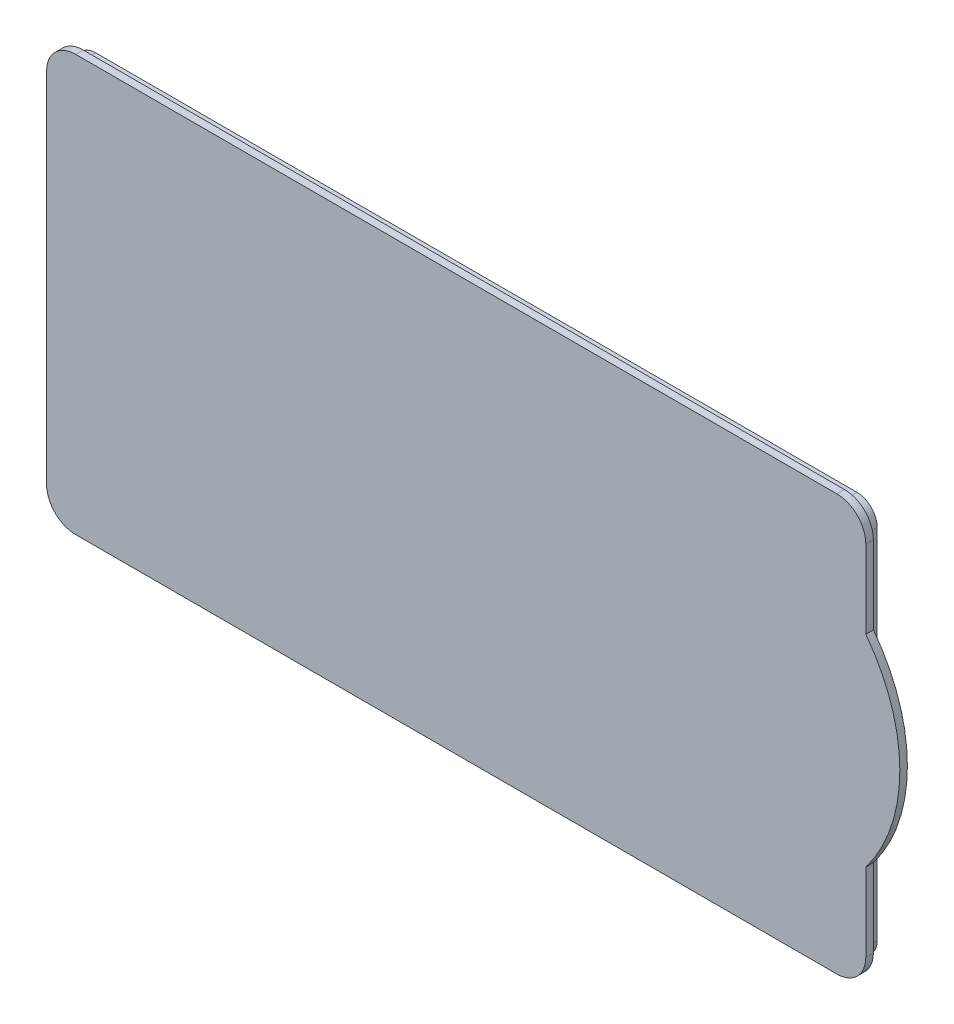
ISO-10303-21;
HEADER;
FILE_DESCRIPTION(('STEP AP214'),'2;1');
FILE_NAME('part.step','',(''),(''),'','','');
FILE_SCHEMA(('AUTOMOTIVE_DESIGN { 1 0 10303 214 1 1 1 1 }'));
ENDSEC;
DATA;
#1=APPLICATION_CONTEXT('core data for automotive mechanical design processes');
#2=APPLICATION_PROTOCOL_DEFINITION('international standard','automotive_design',2000,#1);
#3=PRODUCT_CONTEXT('',#1,'mechanical');
#4=PRODUCT('Part','Part','',(#3));
#5=PRODUCT_RELATED_PRODUCT_CATEGORY('part','',(#4));
#6=PRODUCT_DEFINITION_FORMATION('','',#4);
#7=PRODUCT_DEFINITION_CONTEXT('part definition',#1,'design');
#8=PRODUCT_DEFINITION('design','',#6,#7);
#9=PRODUCT_DEFINITION_SHAPE('','',#8);
#10=(LENGTH_UNIT() NAMED_UNIT(*) SI_UNIT(.MILLI.,.METRE.));
#11=(NAMED_UNIT(*) PLANE_ANGLE_UNIT() SI_UNIT($,.RADIAN.));
#12=(NAMED_UNIT(*) SI_UNIT($,.STERADIAN.) SOLID_ANGLE_UNIT());
#13=UNCERTAINTY_MEASURE_WITH_UNIT(LENGTH_MEASURE(1.E-05),#10,'distance_accuracy_value','');
#14=(GEOMETRIC_REPRESENTATION_CONTEXT(3) GLOBAL_UNCERTAINTY_ASSIGNED_CONTEXT((#13)) GLOBAL_UNIT_ASSIGNED_CONTEXT((#10,
#11,#12)) REPRESENTATION_CONTEXT('',''));
#15=CARTESIAN_POINT('',(0.,0.,0.));
#16=DIRECTION('',(0.,0.,1.));
#17=DIRECTION('',(1.,0.,0.));
#18=AXIS2_PLACEMENT_3D('',#15,#16,#17);
#19=CARTESIAN_POINT('',(151.,-71.,-3.));
#20=DIRECTION('',(0.,0.,1.));
#21=DIRECTION('',(1.,0.,0.));
#22=AXIS2_PLACEMENT_3D('',#19,#20,#21);
#23=PLANE('',#22);
#24=CARTESIAN_POINT('',(-151.,-71.,-3.));
#25=DIRECTION('',(0.,0.,-1.));
#26=DIRECTION('',(-1.,0.,0.));
#27=AXIS2_PLACEMENT_3D('',#24,#25,#26);
#28=CIRCLE('',#27,8.00000000000001);
#29=CARTESIAN_POINT('',(-151.,-79.,-3.));
#30=VERTEX_POINT('',#29);
#31=CARTESIAN_POINT('',(-159.,-71.,-3.));
#32=VERTEX_POINT('',#31);
#33=EDGE_CURVE('E49',#30,#32,#28,.T.);
#34=ORIENTED_EDGE('',*,*,#33,.F.);
#35=DIRECTION('',(-1.,0.,0.));
#36=VECTOR('',#35,1.);
#37=CARTESIAN_POINT('',(151.,-79.,-3.));
#38=LINE('',#37,#36);
#39=CARTESIAN_POINT('',(151.,-79.,-3.));
#40=VERTEX_POINT('',#39);
#41=EDGE_CURVE('E53',#40,#30,#38,.T.);
#42=ORIENTED_EDGE('',*,*,#41,.F.);
#43=CARTESIAN_POINT('',(151.,-71.,-3.));
#44=DIRECTION('',(0.,0.,-1.));
#45=DIRECTION('',(-1.,0.,0.));
#46=AXIS2_PLACEMENT_3D('',#43,#44,#45);
#47=CIRCLE('',#46,8.00000000000006);
#48=CARTESIAN_POINT('',(159.,-71.,-3.));
#49=VERTEX_POINT('',#48);
#50=EDGE_CURVE('E259',#49,#40,#47,.T.);
#51=ORIENTED_EDGE('',*,*,#50,.F.);
#52=DIRECTION('',(0.,-1.,0.));
#53=VECTOR('',#52,1.);
#54=CARTESIAN_POINT('',(159.,71.,-3.));
#55=LINE('',#54,#53);
#56=CARTESIAN_POINT('',(159.,71.,-3.));
#57=VERTEX_POINT('',#56);
#58=EDGE_CURVE('E256',#57,#49,#55,.T.);
#59=ORIENTED_EDGE('',*,*,#58,.F.);
#60=CARTESIAN_POINT('',(151.,71.,-3.));
#61=DIRECTION('',(0.,0.,-1.));
#62=DIRECTION('',(-1.,0.,0.));
#63=AXIS2_PLACEMENT_3D('',#60,#61,#62);
#64=CIRCLE('',#63,8.0000000000001);
#65=CARTESIAN_POINT('',(151.,79.0000000000001,-3.));
#66=VERTEX_POINT('',#65);
#67=EDGE_CURVE('E253',#66,#57,#64,.T.);
#68=ORIENTED_EDGE('',*,*,#67,.F.);
#69=DIRECTION('',(1.,0.,0.));
#70=VECTOR('',#69,1.);
#71=CARTESIAN_POINT('',(-151.,79.,-3.));
#72=LINE('',#71,#70);
#73=CARTESIAN_POINT('',(-151.,79.,-3.));
#74=VERTEX_POINT('',#73);
#75=EDGE_CURVE('E250',#74,#66,#72,.T.);
#76=ORIENTED_EDGE('',*,*,#75,.F.);
#77=CARTESIAN_POINT('',(-151.,70.9999999999999,-3.));
#78=DIRECTION('',(0.,0.,-1.));
#79=DIRECTION('',(-1.,0.,0.));
#80=AXIS2_PLACEMENT_3D('',#77,#78,#79);
#81=CIRCLE('',#80,8.00000000000002);
#82=CARTESIAN_POINT('',(-159.,70.9999999999999,-3.));
#83=VERTEX_POINT('',#82);
#84=EDGE_CURVE('E247',#83,#74,#81,.T.);
#85=ORIENTED_EDGE('',*,*,#84,.F.);
#86=DIRECTION('',(0.,1.,0.));
#87=VECTOR('',#86,1.);
#88=CARTESIAN_POINT('',(-159.,-71.,-3.));
#89=LINE('',#88,#87);
#90=EDGE_CURVE('E244',#32,#83,#89,.T.);
#91=ORIENTED_EDGE('',*,*,#90,.F.);
#92=EDGE_LOOP('',(#34,#42,#51,#59,#68,#76,#85,#91));
#93=FACE_BOUND('',#92,.T.);
#94=CARTESIAN_POINT('',(109.99074074074,0.,-3.));
#95=DIRECTION('',(0.,0.,1.));
#96=DIRECTION('',(1.,0.,0.));
#97=AXIS2_PLACEMENT_3D('',#94,#95,#96);
#98=CIRCLE('',#97,66.0092592592596);
#99=CARTESIAN_POINT('',(162.5,40.,-3.));
#100=VERTEX_POINT('',#99);
#101=CARTESIAN_POINT('',(162.5,-40.,-3.));
#102=VERTEX_POINT('',#101);
#103=EDGE_CURVE('E165',#100,#102,#98,.F.);
#104=ORIENTED_EDGE('',*,*,#103,.T.);
#105=DIRECTION('',(0.,-1.,0.));
#106=VECTOR('',#105,1.);
#107=CARTESIAN_POINT('',(162.5,-71.,-3.));
#108=LINE('',#107,#106);
#109=CARTESIAN_POINT('',(162.5,-71.,-3.));
#110=VERTEX_POINT('',#109);
#111=EDGE_CURVE('E528',#102,#110,#108,.T.);
#112=ORIENTED_EDGE('',*,*,#111,.T.);
#113=CARTESIAN_POINT('',(151.,-71.,-3.));
#114=DIRECTION('',(0.,0.,1.));
#115=DIRECTION('',(1.,0.,0.));
#116=AXIS2_PLACEMENT_3D('',#113,#114,#115);
#117=CIRCLE('',#116,11.5000000000001);
#118=CARTESIAN_POINT('',(151.,-82.5,-3.));
#119=VERTEX_POINT('',#118);
#120=EDGE_CURVE('E526',#110,#119,#117,.F.);
#121=ORIENTED_EDGE('',*,*,#120,.T.);
#122=DIRECTION('',(-1.,0.,0.));
#123=VECTOR('',#122,1.);
#124=CARTESIAN_POINT('',(-151.,-82.5,-3.));
#125=LINE('',#124,#123);
#126=CARTESIAN_POINT('',(-151.,-82.5,-3.));
#127=VERTEX_POINT('',#126);
#128=EDGE_CURVE('E523',#119,#127,#125,.T.);
#129=ORIENTED_EDGE('',*,*,#128,.T.);
#130=CARTESIAN_POINT('',(-151.,-71.,-3.));
#131=DIRECTION('',(0.,0.,1.));
#132=DIRECTION('',(1.,0.,0.));
#133=AXIS2_PLACEMENT_3D('',#130,#131,#132);
#134=CIRCLE('',#133,11.5);
#135=CARTESIAN_POINT('',(-162.5,-71.,-3.));
#136=VERTEX_POINT('',#135);
#137=EDGE_CURVE('E532',#127,#136,#134,.F.);
#138=ORIENTED_EDGE('',*,*,#137,.T.);
#139=DIRECTION('',(0.,1.,0.));
#140=VECTOR('',#139,1.);
#141=CARTESIAN_POINT('',(-162.5,70.9999999999999,-3.));
#142=LINE('',#141,#140);
#143=CARTESIAN_POINT('',(-162.5,70.9999999999999,-3.));
#144=VERTEX_POINT('',#143);
#145=EDGE_CURVE('E516',#136,#144,#142,.T.);
#146=ORIENTED_EDGE('',*,*,#145,.T.);
#147=CARTESIAN_POINT('',(-151.,70.9999999999999,-3.));
#148=DIRECTION('',(0.,0.,1.));
#149=DIRECTION('',(1.,0.,0.));
#150=AXIS2_PLACEMENT_3D('',#147,#148,#149);
#151=CIRCLE('',#150,11.5000000000001);
#152=CARTESIAN_POINT('',(-151.,82.5,-3.));
#153=VERTEX_POINT('',#152);
#154=EDGE_CURVE('E512',#144,#153,#151,.F.);
#155=ORIENTED_EDGE('',*,*,#154,.T.);
#156=DIRECTION('',(1.,0.,0.));
#157=VECTOR('',#156,1.);
#158=CARTESIAN_POINT('',(151.,82.5,-3.));
#159=LINE('',#158,#157);
#160=CARTESIAN_POINT('',(151.,82.5,-3.));
#161=VERTEX_POINT('',#160);
#162=EDGE_CURVE('E504',#153,#161,#159,.T.);
#163=ORIENTED_EDGE('',*,*,#162,.T.);
#164=CARTESIAN_POINT('',(151.,71.,-3.));
#165=DIRECTION('',(0.,0.,1.));
#166=DIRECTION('',(1.,0.,0.));
#167=AXIS2_PLACEMENT_3D('',#164,#165,#166);
#168=CIRCLE('',#167,11.5000000000001);
#169=CARTESIAN_POINT('',(162.5,71.,-3.));
#170=VERTEX_POINT('',#169);
#171=EDGE_CURVE('E207',#161,#170,#168,.F.);
#172=ORIENTED_EDGE('',*,*,#171,.T.);
#173=DIRECTION('',(0.,-1.,0.));
#174=VECTOR('',#173,1.);
#175=CARTESIAN_POINT('',(162.5,40.,-3.));
#176=LINE('',#175,#174);
#177=EDGE_CURVE('E223',#170,#100,#176,.T.);
#178=ORIENTED_EDGE('',*,*,#177,.T.);
#179=EDGE_LOOP('',(#104,#112,#121,#129,#138,#146,#155,#163,#172,#178));
#180=FACE_BOUND('',#179,.T.);
#181=ADVANCED_FACE('F34',(#93,#180),#23,.F.);
#182=CARTESIAN_POINT('',(-151.,-71.,-8.));
#183=DIRECTION('',(0.,0.,1.));
#184=DIRECTION('',(1.,0.,0.));
#185=AXIS2_PLACEMENT_3D('',#182,#183,#184);
#186=CYLINDRICAL_SURFACE('',#185,8.00000000000001);
#187=ORIENTED_EDGE('',*,*,#33,.T.);
#188=DIRECTION('',(0.,0.,1.));
#189=VECTOR('',#188,1.);
#190=CARTESIAN_POINT('',(-159.,-71.,-8.));
#191=LINE('',#190,#189);
#192=CARTESIAN_POINT('',(-159.,-71.,-8.));
#193=VERTEX_POINT('',#192);
#194=EDGE_CURVE('E11',#193,#32,#191,.T.);
#195=ORIENTED_EDGE('',*,*,#194,.F.);
#196=CARTESIAN_POINT('',(-151.,-71.,-8.));
#197=DIRECTION('',(0.,0.,-1.));
#198=DIRECTION('',(-1.,0.,0.));
#199=AXIS2_PLACEMENT_3D('',#196,#197,#198);
#200=CIRCLE('',#199,8.00000000000001);
#201=CARTESIAN_POINT('',(-151.,-79.,-8.));
#202=VERTEX_POINT('',#201);
#203=EDGE_CURVE('E225',#202,#193,#200,.T.);
#204=ORIENTED_EDGE('',*,*,#203,.F.);
#205=DIRECTION('',(0.,0.,1.));
#206=VECTOR('',#205,1.);
#207=CARTESIAN_POINT('',(-151.,-79.,-8.));
#208=LINE('',#207,#206);
#209=EDGE_CURVE('E242',#202,#30,#208,.T.);
#210=ORIENTED_EDGE('',*,*,#209,.T.);
#211=EDGE_LOOP('',(#187,#195,#204,#210));
#212=FACE_BOUND('',#211,.T.);
#213=ADVANCED_FACE('F304',(#212),#186,.T.);
#214=CARTESIAN_POINT('',(-159.,-71.,-8.));
#215=DIRECTION('',(1.,0.,0.));
#216=DIRECTION('',(0.,1.,0.));
#217=AXIS2_PLACEMENT_3D('',#214,#215,#216);
#218=PLANE('',#217);
#219=ORIENTED_EDGE('',*,*,#90,.T.);
#220=DIRECTION('',(0.,0.,1.));
#221=VECTOR('',#220,1.);
#222=CARTESIAN_POINT('',(-159.,70.9999999999999,-8.));
#223=LINE('',#222,#221);
#224=CARTESIAN_POINT('',(-159.,70.9999999999999,-8.));
#225=VERTEX_POINT('',#224);
#226=EDGE_CURVE('E42',#225,#83,#223,.T.);
#227=ORIENTED_EDGE('',*,*,#226,.F.);
#228=DIRECTION('',(0.,1.,0.));
#229=VECTOR('',#228,1.);
#230=CARTESIAN_POINT('',(-159.,-71.,-8.));
#231=LINE('',#230,#229);
#232=EDGE_CURVE('E228',#193,#225,#231,.T.);
#233=ORIENTED_EDGE('',*,*,#232,.F.);
#234=ORIENTED_EDGE('',*,*,#194,.T.);
#235=EDGE_LOOP('',(#219,#227,#233,#234));
#236=FACE_BOUND('',#235,.T.);
#237=ADVANCED_FACE('F285',(#236),#218,.F.);
#238=CARTESIAN_POINT('',(-151.,70.9999999999999,-8.));
#239=DIRECTION('',(0.,0.,1.));
#240=DIRECTION('',(1.,0.,0.));
#241=AXIS2_PLACEMENT_3D('',#238,#239,#240);
#242=CYLINDRICAL_SURFACE('',#241,8.00000000000002);
#243=ORIENTED_EDGE('',*,*,#84,.T.);
#244=DIRECTION('',(0.,0.,1.));
#245=VECTOR('',#244,1.);
#246=CARTESIAN_POINT('',(-151.,79.,-8.));
#247=LINE('',#246,#245);
#248=CARTESIAN_POINT('',(-151.,79.,-8.));
#249=VERTEX_POINT('',#248);
#250=EDGE_CURVE('E276',#249,#74,#247,.T.);
#251=ORIENTED_EDGE('',*,*,#250,.F.);
#252=CARTESIAN_POINT('',(-151.,70.9999999999999,-8.));
#253=DIRECTION('',(0.,0.,-1.));
#254=DIRECTION('',(-1.,0.,0.));
#255=AXIS2_PLACEMENT_3D('',#252,#253,#254);
#256=CIRCLE('',#255,8.00000000000002);
#257=EDGE_CURVE('E230',#225,#249,#256,.T.);
#258=ORIENTED_EDGE('',*,*,#257,.F.);
#259=ORIENTED_EDGE('',*,*,#226,.T.);
#260=EDGE_LOOP('',(#243,#251,#258,#259));
#261=FACE_BOUND('',#260,.T.);
#262=ADVANCED_FACE('F282',(#261),#242,.T.);
#263=CARTESIAN_POINT('',(-151.,79.,-8.));
#264=DIRECTION('',(0.,-1.,0.));
#265=DIRECTION('',(1.,0.,0.));
#266=AXIS2_PLACEMENT_3D('',#263,#264,#265);
#267=PLANE('',#266);
#268=ORIENTED_EDGE('',*,*,#75,.T.);
#269=DIRECTION('',(0.,0.,1.));
#270=VECTOR('',#269,1.);
#271=CARTESIAN_POINT('',(151.,79.0000000000001,-8.));
#272=LINE('',#271,#270);
#273=CARTESIAN_POINT('',(151.,79.0000000000001,-8.));
#274=VERTEX_POINT('',#273);
#275=EDGE_CURVE('E273',#274,#66,#272,.T.);
#276=ORIENTED_EDGE('',*,*,#275,.F.);
#277=DIRECTION('',(1.,0.,0.));
#278=VECTOR('',#277,1.);
#279=CARTESIAN_POINT('',(-151.,79.,-8.));
#280=LINE('',#279,#278);
#281=EDGE_CURVE('E232',#249,#274,#280,.T.);
#282=ORIENTED_EDGE('',*,*,#281,.F.);
#283=ORIENTED_EDGE('',*,*,#250,.T.);
#284=EDGE_LOOP('',(#268,#276,#282,#283));
#285=FACE_BOUND('',#284,.T.);
#286=ADVANCED_FACE('F290',(#285),#267,.F.);
#287=CARTESIAN_POINT('',(151.,71.,-8.));
#288=DIRECTION('',(0.,0.,1.));
#289=DIRECTION('',(1.,0.,0.));
#290=AXIS2_PLACEMENT_3D('',#287,#288,#289);
#291=CYLINDRICAL_SURFACE('',#290,8.0000000000001);
#292=ORIENTED_EDGE('',*,*,#67,.T.);
#293=DIRECTION('',(0.,0.,1.));
#294=VECTOR('',#293,1.);
#295=CARTESIAN_POINT('',(159.,71.,-8.));
#296=LINE('',#295,#294);
#297=CARTESIAN_POINT('',(159.,71.,-8.));
#298=VERTEX_POINT('',#297);
#299=EDGE_CURVE('E270',#298,#57,#296,.T.);
#300=ORIENTED_EDGE('',*,*,#299,.F.);
#301=CARTESIAN_POINT('',(151.,71.,-8.));
#302=DIRECTION('',(0.,0.,-1.));
#303=DIRECTION('',(-1.,0.,0.));
#304=AXIS2_PLACEMENT_3D('',#301,#302,#303);
#305=CIRCLE('',#304,8.0000000000001);
#306=EDGE_CURVE('E234',#274,#298,#305,.T.);
#307=ORIENTED_EDGE('',*,*,#306,.F.);
#308=ORIENTED_EDGE('',*,*,#275,.T.);
#309=EDGE_LOOP('',(#292,#300,#307,#308));
#310=FACE_BOUND('',#309,.T.);
#311=ADVANCED_FACE('F294',(#310),#291,.T.);
#312=CARTESIAN_POINT('',(159.,71.,-8.));
#313=DIRECTION('',(-1.,0.,0.));
#314=DIRECTION('',(0.,-1.,0.));
#315=AXIS2_PLACEMENT_3D('',#312,#313,#314);
#316=PLANE('',#315);
#317=ORIENTED_EDGE('',*,*,#58,.T.);
#318=DIRECTION('',(0.,0.,1.));
#319=VECTOR('',#318,1.);
#320=CARTESIAN_POINT('',(159.,-71.,-8.));
#321=LINE('',#320,#319);
#322=CARTESIAN_POINT('',(159.,-71.,-8.));
#323=VERTEX_POINT('',#322);
#324=EDGE_CURVE('E267',#323,#49,#321,.T.);
#325=ORIENTED_EDGE('',*,*,#324,.F.);
#326=DIRECTION('',(0.,-1.,0.));
#327=VECTOR('',#326,1.);
#328=CARTESIAN_POINT('',(159.,71.,-8.));
#329=LINE('',#328,#327);
#330=EDGE_CURVE('E236',#298,#323,#329,.T.);
#331=ORIENTED_EDGE('',*,*,#330,.F.);
#332=ORIENTED_EDGE('',*,*,#299,.T.);
#333=EDGE_LOOP('',(#317,#325,#331,#332));
#334=FACE_BOUND('',#333,.T.);
#335=ADVANCED_FACE('F312',(#334),#316,.F.);
#336=CARTESIAN_POINT('',(151.,-71.,-8.));
#337=DIRECTION('',(0.,0.,1.));
#338=DIRECTION('',(1.,0.,0.));
#339=AXIS2_PLACEMENT_3D('',#336,#337,#338);
#340=CYLINDRICAL_SURFACE('',#339,8.00000000000006);
#341=ORIENTED_EDGE('',*,*,#50,.T.);
#342=DIRECTION('',(0.,0.,1.));
#343=VECTOR('',#342,1.);
#344=CARTESIAN_POINT('',(151.,-79.,-8.));
#345=LINE('',#344,#343);
#346=CARTESIAN_POINT('',(151.,-79.,-8.));
#347=VERTEX_POINT('',#346);
#348=EDGE_CURVE('E264',#347,#40,#345,.T.);
#349=ORIENTED_EDGE('',*,*,#348,.F.);
#350=CARTESIAN_POINT('',(151.,-71.,-8.));
#351=DIRECTION('',(0.,0.,-1.));
#352=DIRECTION('',(-1.,0.,0.));
#353=AXIS2_PLACEMENT_3D('',#350,#351,#352);
#354=CIRCLE('',#353,8.00000000000006);
#355=EDGE_CURVE('E238',#323,#347,#354,.T.);
#356=ORIENTED_EDGE('',*,*,#355,.F.);
#357=ORIENTED_EDGE('',*,*,#324,.T.);
#358=EDGE_LOOP('',(#341,#349,#356,#357));
#359=FACE_BOUND('',#358,.T.);
#360=ADVANCED_FACE('F310',(#359),#340,.T.);
#361=CARTESIAN_POINT('',(151.,-79.,-8.));
#362=DIRECTION('',(0.,1.,0.));
#363=DIRECTION('',(0.,0.,1.));
#364=AXIS2_PLACEMENT_3D('',#361,#362,#363);
#365=PLANE('',#364);
#366=ORIENTED_EDGE('',*,*,#41,.T.);
#367=ORIENTED_EDGE('',*,*,#209,.F.);
#368=DIRECTION('',(-1.,0.,0.));
#369=VECTOR('',#368,1.);
#370=CARTESIAN_POINT('',(151.,-79.,-8.));
#371=LINE('',#370,#369);
#372=EDGE_CURVE('E240',#347,#202,#371,.T.);
#373=ORIENTED_EDGE('',*,*,#372,.F.);
#374=ORIENTED_EDGE('',*,*,#348,.T.);
#375=EDGE_LOOP('',(#366,#367,#373,#374));
#376=FACE_BOUND('',#375,.T.);
#377=ADVANCED_FACE('F306',(#376),#365,.F.);
#378=CARTESIAN_POINT('',(-151.,-71.,-8.));
#379=DIRECTION('',(0.,0.,-1.));
#380=DIRECTION('',(-1.,0.,0.));
#381=AXIS2_PLACEMENT_3D('',#378,#379,#380);
#382=PLANE('',#381);
#383=ORIENTED_EDGE('',*,*,#203,.T.);
#384=ORIENTED_EDGE('',*,*,#232,.T.);
#385=ORIENTED_EDGE('',*,*,#257,.T.);
#386=ORIENTED_EDGE('',*,*,#281,.T.);
#387=ORIENTED_EDGE('',*,*,#306,.T.);
#388=ORIENTED_EDGE('',*,*,#330,.T.);
#389=ORIENTED_EDGE('',*,*,#355,.T.);
#390=ORIENTED_EDGE('',*,*,#372,.T.);
#391=EDGE_LOOP('',(#383,#384,#385,#386,#387,#388,#389,#390));
#392=FACE_BOUND('',#391,.T.);
#393=ADVANCED_FACE('F298',(#392),#382,.T.);
#394=CARTESIAN_POINT('',(109.99074074074,0.,-379.573034085023));
#395=DIRECTION('',(0.,0.,1.));
#396=DIRECTION('',(1.,0.,0.));
#397=AXIS2_PLACEMENT_3D('',#394,#395,#396);
#398=CYLINDRICAL_SURFACE('',#397,66.0092592592596);
#399=ORIENTED_EDGE('',*,*,#103,.F.);
#400=DIRECTION('',(0.,0.,1.));
#401=VECTOR('',#400,1.);
#402=CARTESIAN_POINT('',(162.5,40.,-379.573034085023));
#403=LINE('',#402,#401);
#404=CARTESIAN_POINT('',(162.5,40.,0.));
#405=VERTEX_POINT('',#404);
#406=EDGE_CURVE('E158',#100,#405,#403,.T.);
#407=ORIENTED_EDGE('',*,*,#406,.T.);
#408=CARTESIAN_POINT('',(109.99074074074,0.,0.));
#409=DIRECTION('',(0.,0.,1.));
#410=DIRECTION('',(-1.,0.,0.));
#411=AXIS2_PLACEMENT_3D('',#408,#409,#410);
#412=CIRCLE('',#411,66.0092592592596);
#413=CARTESIAN_POINT('',(162.5,-40.,0.));
#414=VERTEX_POINT('',#413);
#415=EDGE_CURVE('E163',#414,#405,#412,.T.);
#416=ORIENTED_EDGE('',*,*,#415,.F.);
#417=DIRECTION('',(0.,0.,1.));
#418=VECTOR('',#417,1.);
#419=CARTESIAN_POINT('',(162.5,-40.,-379.573034085023));
#420=LINE('',#419,#418);
#421=EDGE_CURVE('E205',#102,#414,#420,.T.);
#422=ORIENTED_EDGE('',*,*,#421,.F.);
#423=EDGE_LOOP('',(#399,#407,#416,#422));
#424=FACE_BOUND('',#423,.T.);
#425=ADVANCED_FACE('F160',(#424),#398,.T.);
#426=CARTESIAN_POINT('',(162.5,-71.,-379.573034085023));
#427=DIRECTION('',(1.,0.,0.));
#428=DIRECTION('',(0.,1.,0.));
#429=AXIS2_PLACEMENT_3D('',#426,#427,#428);
#430=PLANE('',#429);
#431=ORIENTED_EDGE('',*,*,#111,.F.);
#432=ORIENTED_EDGE('',*,*,#421,.T.);
#433=DIRECTION('',(0.,1.,0.));
#434=VECTOR('',#433,1.);
#435=CARTESIAN_POINT('',(162.5,-71.,0.));
#436=LINE('',#435,#434);
#437=CARTESIAN_POINT('',(162.5,-71.,0.));
#438=VERTEX_POINT('',#437);
#439=EDGE_CURVE('E169',#438,#414,#436,.T.);
#440=ORIENTED_EDGE('',*,*,#439,.F.);
#441=DIRECTION('',(0.,0.,1.));
#442=VECTOR('',#441,1.);
#443=CARTESIAN_POINT('',(162.5,-71.,-379.573034085023));
#444=LINE('',#443,#442);
#445=EDGE_CURVE('E208',#110,#438,#444,.T.);
#446=ORIENTED_EDGE('',*,*,#445,.F.);
#447=EDGE_LOOP('',(#431,#432,#440,#446));
#448=FACE_BOUND('',#447,.T.);
#449=ADVANCED_FACE('F380',(#448),#430,.T.);
#450=CARTESIAN_POINT('',(151.,-71.,-379.573034085023));
#451=DIRECTION('',(0.,0.,1.));
#452=DIRECTION('',(1.,0.,0.));
#453=AXIS2_PLACEMENT_3D('',#450,#451,#452);
#454=CYLINDRICAL_SURFACE('',#453,11.5000000000001);
#455=ORIENTED_EDGE('',*,*,#120,.F.);
#456=ORIENTED_EDGE('',*,*,#445,.T.);
#457=CARTESIAN_POINT('',(151.,-71.,0.));
#458=DIRECTION('',(0.,0.,1.));
#459=DIRECTION('',(1.,0.,0.));
#460=AXIS2_PLACEMENT_3D('',#457,#458,#459);
#461=CIRCLE('',#460,11.5000000000001);
#462=CARTESIAN_POINT('',(151.,-82.5,0.));
#463=VERTEX_POINT('',#462);
#464=EDGE_CURVE('E202',#463,#438,#461,.T.);
#465=ORIENTED_EDGE('',*,*,#464,.F.);
#466=DIRECTION('',(0.,0.,1.));
#467=VECTOR('',#466,1.);
#468=CARTESIAN_POINT('',(151.,-82.5,-379.573034085023));
#469=LINE('',#468,#467);
#470=EDGE_CURVE('E210',#119,#463,#469,.T.);
#471=ORIENTED_EDGE('',*,*,#470,.F.);
#472=EDGE_LOOP('',(#455,#456,#465,#471));
#473=FACE_BOUND('',#472,.T.);
#474=ADVANCED_FACE('F389',(#473),#454,.T.);
#475=CARTESIAN_POINT('',(-151.,-82.5,-379.573034085023));
#476=DIRECTION('',(0.,-1.,0.));
#477=DIRECTION('',(0.,0.,-1.));
#478=AXIS2_PLACEMENT_3D('',#475,#476,#477);
#479=PLANE('',#478);
#480=ORIENTED_EDGE('',*,*,#128,.F.);
#481=ORIENTED_EDGE('',*,*,#470,.T.);
#482=DIRECTION('',(1.,0.,0.));
#483=VECTOR('',#482,1.);
#484=CARTESIAN_POINT('',(-151.,-82.5,0.));
#485=LINE('',#484,#483);
#486=CARTESIAN_POINT('',(-151.,-82.5,0.));
#487=VERTEX_POINT('',#486);
#488=EDGE_CURVE('E199',#487,#463,#485,.T.);
#489=ORIENTED_EDGE('',*,*,#488,.F.);
#490=DIRECTION('',(0.,0.,1.));
#491=VECTOR('',#490,1.);
#492=CARTESIAN_POINT('',(-151.,-82.5,-379.573034085023));
#493=LINE('',#492,#491);
#494=EDGE_CURVE('E212',#127,#487,#493,.T.);
#495=ORIENTED_EDGE('',*,*,#494,.F.);
#496=EDGE_LOOP('',(#480,#481,#489,#495));
#497=FACE_BOUND('',#496,.T.);
#498=ADVANCED_FACE('F399',(#497),#479,.T.);
#499=CARTESIAN_POINT('',(-151.,-71.,-379.573034085023));
#500=DIRECTION('',(0.,0.,1.));
#501=DIRECTION('',(1.,0.,0.));
#502=AXIS2_PLACEMENT_3D('',#499,#500,#501);
#503=CYLINDRICAL_SURFACE('',#502,11.5);
#504=ORIENTED_EDGE('',*,*,#137,.F.);
#505=ORIENTED_EDGE('',*,*,#494,.T.);
#506=CARTESIAN_POINT('',(-151.,-71.,0.));
#507=DIRECTION('',(0.,0.,1.));
#508=DIRECTION('',(1.,0.,0.));
#509=AXIS2_PLACEMENT_3D('',#506,#507,#508);
#510=CIRCLE('',#509,11.5);
#511=CARTESIAN_POINT('',(-162.5,-71.,0.));
#512=VERTEX_POINT('',#511);
#513=EDGE_CURVE('E196',#512,#487,#510,.T.);
#514=ORIENTED_EDGE('',*,*,#513,.F.);
#515=DIRECTION('',(0.,0.,1.));
#516=VECTOR('',#515,1.);
#517=CARTESIAN_POINT('',(-162.5,-71.,-379.573034085023));
#518=LINE('',#517,#516);
#519=EDGE_CURVE('E214',#136,#512,#518,.T.);
#520=ORIENTED_EDGE('',*,*,#519,.F.);
#521=EDGE_LOOP('',(#504,#505,#514,#520));
#522=FACE_BOUND('',#521,.T.);
#523=ADVANCED_FACE('F409',(#522),#503,.T.);
#524=CARTESIAN_POINT('',(-162.5,70.9999999999999,-379.573034085023));
#525=DIRECTION('',(-1.,0.,0.));
#526=DIRECTION('',(0.,-1.,0.));
#527=AXIS2_PLACEMENT_3D('',#524,#525,#526);
#528=PLANE('',#527);
#529=ORIENTED_EDGE('',*,*,#145,.F.);
#530=ORIENTED_EDGE('',*,*,#519,.T.);
#531=DIRECTION('',(0.,-1.,0.));
#532=VECTOR('',#531,1.);
#533=CARTESIAN_POINT('',(-162.5,70.9999999999999,0.));
#534=LINE('',#533,#532);
#535=CARTESIAN_POINT('',(-162.5,70.9999999999999,0.));
#536=VERTEX_POINT('',#535);
#537=EDGE_CURVE('E193',#536,#512,#534,.T.);
#538=ORIENTED_EDGE('',*,*,#537,.F.);
#539=DIRECTION('',(0.,0.,1.));
#540=VECTOR('',#539,1.);
#541=CARTESIAN_POINT('',(-162.5,70.9999999999999,-379.573034085023));
#542=LINE('',#541,#540);
#543=EDGE_CURVE('E216',#144,#536,#542,.T.);
#544=ORIENTED_EDGE('',*,*,#543,.F.);
#545=EDGE_LOOP('',(#529,#530,#538,#544));
#546=FACE_BOUND('',#545,.T.);
#547=ADVANCED_FACE('F419',(#546),#528,.T.);
#548=CARTESIAN_POINT('',(-151.,70.9999999999999,-379.573034085023));
#549=DIRECTION('',(0.,0.,1.));
#550=DIRECTION('',(1.,0.,0.));
#551=AXIS2_PLACEMENT_3D('',#548,#549,#550);
#552=CYLINDRICAL_SURFACE('',#551,11.5000000000001);
#553=ORIENTED_EDGE('',*,*,#154,.F.);
#554=ORIENTED_EDGE('',*,*,#543,.T.);
#555=CARTESIAN_POINT('',(-151.,70.9999999999999,0.));
#556=DIRECTION('',(0.,0.,1.));
#557=DIRECTION('',(1.,0.,0.));
#558=AXIS2_PLACEMENT_3D('',#555,#556,#557);
#559=CIRCLE('',#558,11.5000000000001);
#560=CARTESIAN_POINT('',(-151.,82.5,0.));
#561=VERTEX_POINT('',#560);
#562=EDGE_CURVE('E190',#561,#536,#559,.T.);
#563=ORIENTED_EDGE('',*,*,#562,.F.);
#564=DIRECTION('',(0.,0.,1.));
#565=VECTOR('',#564,1.);
#566=CARTESIAN_POINT('',(-151.,82.5,-379.573034085023));
#567=LINE('',#566,#565);
#568=EDGE_CURVE('E218',#153,#561,#567,.T.);
#569=ORIENTED_EDGE('',*,*,#568,.F.);
#570=EDGE_LOOP('',(#553,#554,#563,#569));
#571=FACE_BOUND('',#570,.T.);
#572=ADVANCED_FACE('F429',(#571),#552,.T.);
#573=CARTESIAN_POINT('',(151.,82.5,-379.573034085023));
#574=DIRECTION('',(0.,1.,0.));
#575=DIRECTION('',(-1.,0.,0.));
#576=AXIS2_PLACEMENT_3D('',#573,#574,#575);
#577=PLANE('',#576);
#578=ORIENTED_EDGE('',*,*,#162,.F.);
#579=ORIENTED_EDGE('',*,*,#568,.T.);
#580=DIRECTION('',(-1.,0.,0.));
#581=VECTOR('',#580,1.);
#582=CARTESIAN_POINT('',(151.,82.5,0.));
#583=LINE('',#582,#581);
#584=CARTESIAN_POINT('',(151.,82.5,0.));
#585=VERTEX_POINT('',#584);
#586=EDGE_CURVE('E187',#585,#561,#583,.T.);
#587=ORIENTED_EDGE('',*,*,#586,.F.);
#588=DIRECTION('',(0.,0.,1.));
#589=VECTOR('',#588,1.);
#590=CARTESIAN_POINT('',(151.,82.5,-379.573034085023));
#591=LINE('',#590,#589);
#592=EDGE_CURVE('E220',#161,#585,#591,.T.);
#593=ORIENTED_EDGE('',*,*,#592,.F.);
#594=EDGE_LOOP('',(#578,#579,#587,#593));
#595=FACE_BOUND('',#594,.T.);
#596=ADVANCED_FACE('F439',(#595),#577,.T.);
#597=CARTESIAN_POINT('',(151.,71.,-379.573034085023));
#598=DIRECTION('',(0.,0.,1.));
#599=DIRECTION('',(1.,0.,0.));
#600=AXIS2_PLACEMENT_3D('',#597,#598,#599);
#601=CYLINDRICAL_SURFACE('',#600,11.5000000000001);
#602=ORIENTED_EDGE('',*,*,#171,.F.);
#603=ORIENTED_EDGE('',*,*,#592,.T.);
#604=CARTESIAN_POINT('',(151.,71.,0.));
#605=DIRECTION('',(0.,0.,1.));
#606=DIRECTION('',(1.,0.,0.));
#607=AXIS2_PLACEMENT_3D('',#604,#605,#606);
#608=CIRCLE('',#607,11.5000000000001);
#609=CARTESIAN_POINT('',(162.5,71.,0.));
#610=VERTEX_POINT('',#609);
#611=EDGE_CURVE('E178',#610,#585,#608,.T.);
#612=ORIENTED_EDGE('',*,*,#611,.F.);
#613=DIRECTION('',(0.,0.,1.));
#614=VECTOR('',#613,1.);
#615=CARTESIAN_POINT('',(162.5,71.,-379.573034085023));
#616=LINE('',#615,#614);
#617=EDGE_CURVE('E168',#170,#610,#616,.T.);
#618=ORIENTED_EDGE('',*,*,#617,.F.);
#619=EDGE_LOOP('',(#602,#603,#612,#618));
#620=FACE_BOUND('',#619,.T.);
#621=ADVANCED_FACE('F449',(#620),#601,.T.);
#622=CARTESIAN_POINT('',(162.5,40.,-379.573034085023));
#623=DIRECTION('',(1.,0.,0.));
#624=DIRECTION('',(0.,1.,0.));
#625=AXIS2_PLACEMENT_3D('',#622,#623,#624);
#626=PLANE('',#625);
#627=ORIENTED_EDGE('',*,*,#177,.F.);
#628=ORIENTED_EDGE('',*,*,#617,.T.);
#629=DIRECTION('',(0.,1.,0.));
#630=VECTOR('',#629,1.);
#631=CARTESIAN_POINT('',(162.5,40.,0.));
#632=LINE('',#631,#630);
#633=EDGE_CURVE('E172',#405,#610,#632,.T.);
#634=ORIENTED_EDGE('',*,*,#633,.F.);
#635=ORIENTED_EDGE('',*,*,#406,.F.);
#636=EDGE_LOOP('',(#627,#628,#634,#635));
#637=FACE_BOUND('',#636,.T.);
#638=ADVANCED_FACE('F173',(#637),#626,.T.);
#639=CARTESIAN_POINT('',(151.,-71.,0.));
#640=DIRECTION('',(0.,0.,1.));
#641=DIRECTION('',(1.,0.,0.));
#642=AXIS2_PLACEMENT_3D('',#639,#640,#641);
#643=PLANE('',#642);
#644=ORIENTED_EDGE('',*,*,#415,.T.);
#645=ORIENTED_EDGE('',*,*,#633,.T.);
#646=ORIENTED_EDGE('',*,*,#611,.T.);
#647=ORIENTED_EDGE('',*,*,#586,.T.);
#648=ORIENTED_EDGE('',*,*,#562,.T.);
#649=ORIENTED_EDGE('',*,*,#537,.T.);
#650=ORIENTED_EDGE('',*,*,#513,.T.);
#651=ORIENTED_EDGE('',*,*,#488,.T.);
#652=ORIENTED_EDGE('',*,*,#464,.T.);
#653=ORIENTED_EDGE('',*,*,#439,.T.);
#654=EDGE_LOOP('',(#644,#645,#646,#647,#648,#649,#650,#651,#652,#653));
#655=FACE_BOUND('',#654,.T.);
#656=ADVANCED_FACE('F36',(#655),#643,.T.);
#657=CLOSED_SHELL('',(#181,#213,#237,#262,#286,#311,#335,#360,#377,#393,#425,#449,#474,#498,
#523,#547,#572,#596,#621,#638,#656));
#658=MANIFOLD_SOLID_BREP('B2',#657);
#659=ADVANCED_BREP_SHAPE_REPRESENTATION('',(#18,#658),#14);
#660=SHAPE_DEFINITION_REPRESENTATION(#9,#659);
ENDSEC;
END-ISO-10303-21;
